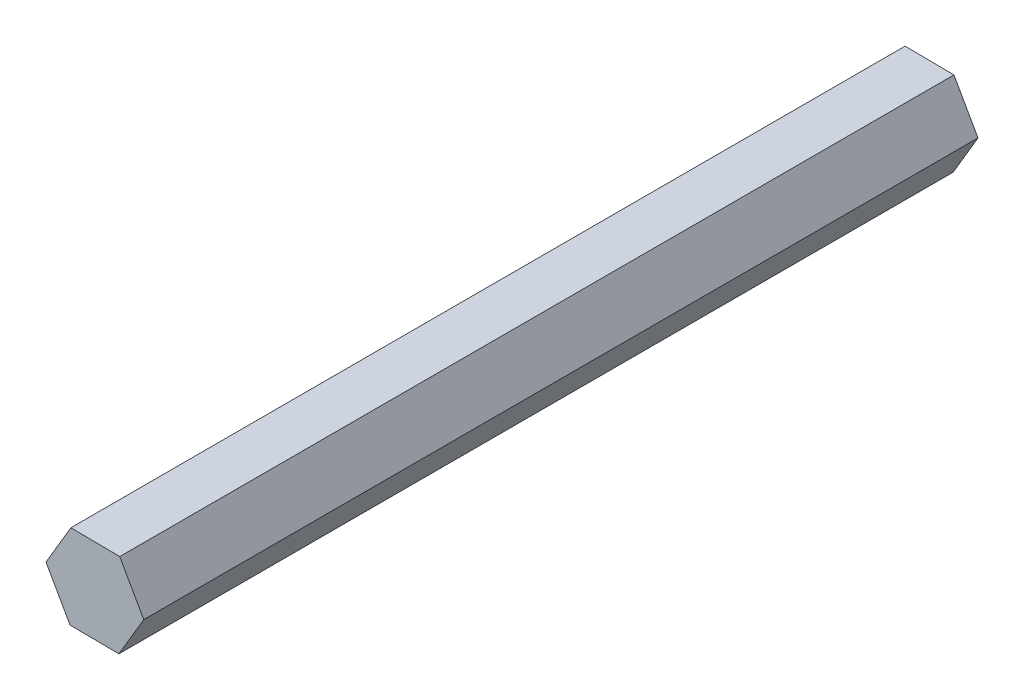
ISO-10303-21;
HEADER;
FILE_DESCRIPTION(('STEP AP214'),'2;1');
FILE_NAME('part.step','',(''),(''),'','','');
FILE_SCHEMA(('AUTOMOTIVE_DESIGN { 1 0 10303 214 1 1 1 1 }'));
ENDSEC;
DATA;
#1=APPLICATION_CONTEXT('core data for automotive mechanical design processes');
#2=APPLICATION_PROTOCOL_DEFINITION('international standard','automotive_design',2000,#1);
#3=PRODUCT_CONTEXT('',#1,'mechanical');
#4=PRODUCT('Part','Part','',(#3));
#5=PRODUCT_RELATED_PRODUCT_CATEGORY('part','',(#4));
#6=PRODUCT_DEFINITION_FORMATION('','',#4);
#7=PRODUCT_DEFINITION_CONTEXT('part definition',#1,'design');
#8=PRODUCT_DEFINITION('design','',#6,#7);
#9=PRODUCT_DEFINITION_SHAPE('','',#8);
#10=(LENGTH_UNIT() NAMED_UNIT(*) SI_UNIT(.MILLI.,.METRE.));
#11=(NAMED_UNIT(*) PLANE_ANGLE_UNIT() SI_UNIT($,.RADIAN.));
#12=(NAMED_UNIT(*) SI_UNIT($,.STERADIAN.) SOLID_ANGLE_UNIT());
#13=UNCERTAINTY_MEASURE_WITH_UNIT(LENGTH_MEASURE(1.E-05),#10,'distance_accuracy_value','');
#14=(GEOMETRIC_REPRESENTATION_CONTEXT(3) GLOBAL_UNCERTAINTY_ASSIGNED_CONTEXT((#13)) GLOBAL_UNIT_ASSIGNED_CONTEXT((#10,
#11,#12)) REPRESENTATION_CONTEXT('',''));
#15=CARTESIAN_POINT('',(0.,0.,0.));
#16=DIRECTION('',(0.,0.,1.));
#17=DIRECTION('',(1.,0.,0.));
#18=AXIS2_PLACEMENT_3D('',#15,#16,#17);
#19=CARTESIAN_POINT('',(-5.05483933116837,-1.34008619529019,46.1));
#20=DIRECTION('',(0.00967894346967524,0.999953157929566,0.));
#21=DIRECTION('',(-0.999953157929566,0.00967894346967524,0.));
#22=AXIS2_PLACEMENT_3D('',#19,#20,#21);
#23=PLANE('',#22);
#24=DIRECTION('',(0.999953157929566,-0.00967894346967524,0.));
#25=VECTOR('',#24,1.);
#26=CARTESIAN_POINT('',(-5.05483933116837,-1.34008619529019,0.));
#27=LINE('',#26,#25);
#28=CARTESIAN_POINT('',(-5.05483933116837,-1.34008619529019,0.));
#29=VERTEX_POINT('',#28);
#30=CARTESIAN_POINT('',(-2.35296663860057,-1.36623869338097,0.));
#31=VERTEX_POINT('',#30);
#32=EDGE_CURVE('E134',#29,#31,#27,.T.);
#33=ORIENTED_EDGE('',*,*,#32,.T.);
#34=DIRECTION('',(0.,0.,-1.));
#35=VECTOR('',#34,1.);
#36=CARTESIAN_POINT('',(-2.35296663860057,-1.36623869338097,46.1));
#37=LINE('',#36,#35);
#38=CARTESIAN_POINT('',(-2.35296663860057,-1.36623869338097,46.1));
#39=VERTEX_POINT('',#38);
#40=EDGE_CURVE('E11',#39,#31,#37,.T.);
#41=ORIENTED_EDGE('',*,*,#40,.F.);
#42=DIRECTION('',(0.999953157929566,-0.00967894346967524,0.));
#43=VECTOR('',#42,1.);
#44=CARTESIAN_POINT('',(-5.05483933116837,-1.34008619529019,46.1));
#45=LINE('',#44,#43);
#46=CARTESIAN_POINT('',(-5.05483933116837,-1.34008619529019,46.1));
#47=VERTEX_POINT('',#46);
#48=EDGE_CURVE('E150',#47,#39,#45,.T.);
#49=ORIENTED_EDGE('',*,*,#48,.F.);
#50=DIRECTION('',(0.,0.,-1.));
#51=VECTOR('',#50,1.);
#52=CARTESIAN_POINT('',(-5.05483933116837,-1.34008619529019,46.1));
#53=LINE('',#52,#51);
#54=EDGE_CURVE('E130',#47,#29,#53,.T.);
#55=ORIENTED_EDGE('',*,*,#54,.T.);
#56=EDGE_LOOP('',(#33,#41,#49,#55));
#57=FACE_BOUND('',#56,.T.);
#58=ADVANCED_FACE('F45',(#57),#23,.F.);
#59=CARTESIAN_POINT('',(-2.35296663860057,-1.36623869338097,46.1));
#60=DIRECTION('',(-0.861145365626639,0.508358789891315,0.));
#61=DIRECTION('',(-0.508358789891315,-0.861145365626639,0.));
#62=AXIS2_PLACEMENT_3D('',#59,#60,#61);
#63=PLANE('',#62);
#64=DIRECTION('',(0.508358789891315,0.861145365626639,0.));
#65=VECTOR('',#64,1.);
#66=CARTESIAN_POINT('',(-2.35296663860057,-1.36623869338097,0.));
#67=LINE('',#66,#65);
#68=CARTESIAN_POINT('',(-0.979381564597625,0.96057544712882,0.));
#69=VERTEX_POINT('',#68);
#70=EDGE_CURVE('E138',#31,#69,#67,.T.);
#71=ORIENTED_EDGE('',*,*,#70,.T.);
#72=DIRECTION('',(0.,0.,-1.));
#73=VECTOR('',#72,1.);
#74=CARTESIAN_POINT('',(-0.979381564597625,0.96057544712882,46.1));
#75=LINE('',#74,#73);
#76=CARTESIAN_POINT('',(-0.979381564597625,0.96057544712882,46.1));
#77=VERTEX_POINT('',#76);
#78=EDGE_CURVE('E54',#77,#69,#75,.T.);
#79=ORIENTED_EDGE('',*,*,#78,.F.);
#80=DIRECTION('',(0.508358789891315,0.861145365626639,0.));
#81=VECTOR('',#80,1.);
#82=CARTESIAN_POINT('',(-2.35296663860057,-1.36623869338097,46.1));
#83=LINE('',#82,#81);
#84=EDGE_CURVE('E99',#39,#77,#83,.T.);
#85=ORIENTED_EDGE('',*,*,#84,.F.);
#86=ORIENTED_EDGE('',*,*,#40,.T.);
#87=EDGE_LOOP('',(#71,#79,#85,#86));
#88=FACE_BOUND('',#87,.T.);
#89=ADVANCED_FACE('F178',(#88),#63,.F.);
#90=CARTESIAN_POINT('',(-0.979381564597625,0.96057544712882,46.1));
#91=DIRECTION('',(-0.870824309096314,-0.491594368038251,0.));
#92=DIRECTION('',(0.491594368038251,-0.870824309096314,0.));
#93=AXIS2_PLACEMENT_3D('',#90,#91,#92);
#94=PLANE('',#93);
#95=DIRECTION('',(-0.491594368038251,0.870824309096314,0.));
#96=VECTOR('',#95,1.);
#97=CARTESIAN_POINT('',(-0.979381564597625,0.96057544712882,0.));
#98=LINE('',#97,#96);
#99=CARTESIAN_POINT('',(-2.30766918316249,3.31354208572939,0.));
#100=VERTEX_POINT('',#99);
#101=EDGE_CURVE('E141',#69,#100,#98,.T.);
#102=ORIENTED_EDGE('',*,*,#101,.T.);
#103=DIRECTION('',(0.,0.,-1.));
#104=VECTOR('',#103,1.);
#105=CARTESIAN_POINT('',(-2.30766918316249,3.31354208572939,46.1));
#106=LINE('',#105,#104);
#107=CARTESIAN_POINT('',(-2.30766918316249,3.31354208572939,46.1));
#108=VERTEX_POINT('',#107);
#109=EDGE_CURVE('E123',#108,#100,#106,.T.);
#110=ORIENTED_EDGE('',*,*,#109,.F.);
#111=DIRECTION('',(-0.491594368038251,0.870824309096314,0.));
#112=VECTOR('',#111,1.);
#113=CARTESIAN_POINT('',(-0.979381564597625,0.96057544712882,46.1));
#114=LINE('',#113,#112);
#115=EDGE_CURVE('E112',#77,#108,#114,.T.);
#116=ORIENTED_EDGE('',*,*,#115,.F.);
#117=ORIENTED_EDGE('',*,*,#78,.T.);
#118=EDGE_LOOP('',(#102,#110,#116,#117));
#119=FACE_BOUND('',#118,.T.);
#120=ADVANCED_FACE('F160',(#119),#94,.F.);
#121=CARTESIAN_POINT('',(-2.30766918316249,3.31354208572939,46.1));
#122=DIRECTION('',(-0.0096789434696751,-0.999953157929566,0.));
#123=DIRECTION('',(0.999953157929566,-0.0096789434696751,0.));
#124=AXIS2_PLACEMENT_3D('',#121,#122,#123);
#125=PLANE('',#124);
#126=DIRECTION('',(-0.999953157929566,0.00967894346967509,0.));
#127=VECTOR('',#126,1.);
#128=CARTESIAN_POINT('',(-2.30766918316249,3.31354208572939,0.));
#129=LINE('',#128,#127);
#130=CARTESIAN_POINT('',(-5.00954187573029,3.33969458382017,0.));
#131=VERTEX_POINT('',#130);
#132=EDGE_CURVE('E121',#100,#131,#129,.T.);
#133=ORIENTED_EDGE('',*,*,#132,.T.);
#134=DIRECTION('',(0.,0.,-1.));
#135=VECTOR('',#134,1.);
#136=CARTESIAN_POINT('',(-5.00954187573029,3.33969458382017,46.1));
#137=LINE('',#136,#135);
#138=CARTESIAN_POINT('',(-5.00954187573029,3.33969458382017,46.1));
#139=VERTEX_POINT('',#138);
#140=EDGE_CURVE('E118',#139,#131,#137,.T.);
#141=ORIENTED_EDGE('',*,*,#140,.F.);
#142=DIRECTION('',(-0.999953157929566,0.00967894346967509,0.));
#143=VECTOR('',#142,1.);
#144=CARTESIAN_POINT('',(-2.30766918316249,3.31354208572939,46.1));
#145=LINE('',#144,#143);
#146=EDGE_CURVE('E106',#108,#139,#145,.T.);
#147=ORIENTED_EDGE('',*,*,#146,.F.);
#148=ORIENTED_EDGE('',*,*,#109,.T.);
#149=EDGE_LOOP('',(#133,#141,#147,#148));
#150=FACE_BOUND('',#149,.T.);
#151=ADVANCED_FACE('F119',(#150),#125,.F.);
#152=CARTESIAN_POINT('',(-5.00954187573029,3.33969458382017,46.1));
#153=DIRECTION('',(0.861145365626639,-0.508358789891316,0.));
#154=DIRECTION('',(0.508358789891316,0.861145365626639,0.));
#155=AXIS2_PLACEMENT_3D('',#152,#153,#154);
#156=PLANE('',#155);
#157=DIRECTION('',(-0.508358789891316,-0.861145365626639,0.));
#158=VECTOR('',#157,1.);
#159=CARTESIAN_POINT('',(-5.00954187573029,3.33969458382017,0.));
#160=LINE('',#159,#158);
#161=CARTESIAN_POINT('',(-6.38312694973324,1.01288044331038,0.));
#162=VERTEX_POINT('',#161);
#163=EDGE_CURVE('E85',#131,#162,#160,.T.);
#164=ORIENTED_EDGE('',*,*,#163,.T.);
#165=DIRECTION('',(0.,0.,-1.));
#166=VECTOR('',#165,1.);
#167=CARTESIAN_POINT('',(-6.38312694973324,1.01288044331038,46.1));
#168=LINE('',#167,#166);
#169=CARTESIAN_POINT('',(-6.38312694973324,1.01288044331038,46.1));
#170=VERTEX_POINT('',#169);
#171=EDGE_CURVE('E124',#170,#162,#168,.T.);
#172=ORIENTED_EDGE('',*,*,#171,.F.);
#173=DIRECTION('',(-0.508358789891316,-0.861145365626639,0.));
#174=VECTOR('',#173,1.);
#175=CARTESIAN_POINT('',(-5.00954187573029,3.33969458382017,46.1));
#176=LINE('',#175,#174);
#177=EDGE_CURVE('E110',#139,#170,#176,.T.);
#178=ORIENTED_EDGE('',*,*,#177,.F.);
#179=ORIENTED_EDGE('',*,*,#140,.T.);
#180=EDGE_LOOP('',(#164,#172,#178,#179));
#181=FACE_BOUND('',#180,.T.);
#182=ADVANCED_FACE('F126',(#181),#156,.F.);
#183=CARTESIAN_POINT('',(-6.38312694973324,1.01288044331038,46.1));
#184=DIRECTION('',(0.870824309096314,0.49159436803825,0.));
#185=DIRECTION('',(-0.49159436803825,0.870824309096314,0.));
#186=AXIS2_PLACEMENT_3D('',#183,#184,#185);
#187=PLANE('',#186);
#188=DIRECTION('',(0.491594368038251,-0.870824309096314,0.));
#189=VECTOR('',#188,1.);
#190=CARTESIAN_POINT('',(-6.38312694973324,1.01288044331038,0.));
#191=LINE('',#190,#189);
#192=EDGE_CURVE('E91',#162,#29,#191,.T.);
#193=ORIENTED_EDGE('',*,*,#192,.T.);
#194=ORIENTED_EDGE('',*,*,#54,.F.);
#195=DIRECTION('',(0.491594368038251,-0.870824309096314,0.));
#196=VECTOR('',#195,1.);
#197=CARTESIAN_POINT('',(-6.38312694973324,1.01288044331038,46.1));
#198=LINE('',#197,#196);
#199=EDGE_CURVE('E62',#170,#47,#198,.T.);
#200=ORIENTED_EDGE('',*,*,#199,.F.);
#201=ORIENTED_EDGE('',*,*,#171,.T.);
#202=EDGE_LOOP('',(#193,#194,#200,#201));
#203=FACE_BOUND('',#202,.T.);
#204=ADVANCED_FACE('F167',(#203),#187,.F.);
#205=CARTESIAN_POINT('',(0.,0.,46.1));
#206=DIRECTION('',(0.,0.,1.));
#207=DIRECTION('',(1.,0.,0.));
#208=AXIS2_PLACEMENT_3D('',#205,#206,#207);
#209=PLANE('',#208);
#210=ORIENTED_EDGE('',*,*,#48,.T.);
#211=ORIENTED_EDGE('',*,*,#84,.T.);
#212=ORIENTED_EDGE('',*,*,#115,.T.);
#213=ORIENTED_EDGE('',*,*,#146,.T.);
#214=ORIENTED_EDGE('',*,*,#177,.T.);
#215=ORIENTED_EDGE('',*,*,#199,.T.);
#216=EDGE_LOOP('',(#210,#211,#212,#213,#214,#215));
#217=FACE_BOUND('',#216,.T.);
#218=ADVANCED_FACE('F108',(#217),#209,.T.);
#219=CARTESIAN_POINT('',(0.,0.,0.));
#220=DIRECTION('',(0.,0.,1.));
#221=DIRECTION('',(1.,0.,0.));
#222=AXIS2_PLACEMENT_3D('',#219,#220,#221);
#223=PLANE('',#222);
#224=ORIENTED_EDGE('',*,*,#32,.F.);
#225=ORIENTED_EDGE('',*,*,#192,.F.);
#226=ORIENTED_EDGE('',*,*,#163,.F.);
#227=ORIENTED_EDGE('',*,*,#132,.F.);
#228=ORIENTED_EDGE('',*,*,#101,.F.);
#229=ORIENTED_EDGE('',*,*,#70,.F.);
#230=EDGE_LOOP('',(#224,#225,#226,#227,#228,#229));
#231=FACE_BOUND('',#230,.T.);
#232=ADVANCED_FACE('F163',(#231),#223,.F.);
#233=CLOSED_SHELL('',(#58,#89,#120,#151,#182,#204,#218,#232));
#234=MANIFOLD_SOLID_BREP('B2',#233);
#235=ADVANCED_BREP_SHAPE_REPRESENTATION('',(#18,#234),#14);
#236=SHAPE_DEFINITION_REPRESENTATION(#9,#235);
ENDSEC;
END-ISO-10303-21;
